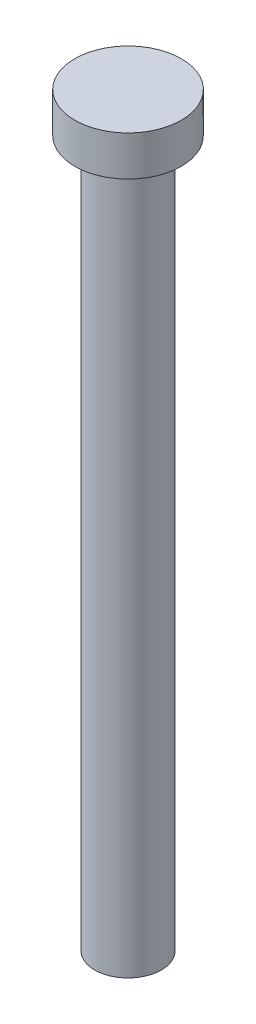
ISO-10303-21;
HEADER;
FILE_DESCRIPTION(('STEP AP214'),'2;1');
FILE_NAME('part.step','',(''),(''),'','','');
FILE_SCHEMA(('AUTOMOTIVE_DESIGN { 1 0 10303 214 1 1 1 1 }'));
ENDSEC;
DATA;
#1=APPLICATION_CONTEXT('core data for automotive mechanical design processes');
#2=APPLICATION_PROTOCOL_DEFINITION('international standard','automotive_design',2000,#1);
#3=PRODUCT_CONTEXT('',#1,'mechanical');
#4=PRODUCT('Part','Part','',(#3));
#5=PRODUCT_RELATED_PRODUCT_CATEGORY('part','',(#4));
#6=PRODUCT_DEFINITION_FORMATION('','',#4);
#7=PRODUCT_DEFINITION_CONTEXT('part definition',#1,'design');
#8=PRODUCT_DEFINITION('design','',#6,#7);
#9=PRODUCT_DEFINITION_SHAPE('','',#8);
#10=(LENGTH_UNIT() NAMED_UNIT(*) SI_UNIT(.MILLI.,.METRE.));
#11=(NAMED_UNIT(*) PLANE_ANGLE_UNIT() SI_UNIT($,.RADIAN.));
#12=(NAMED_UNIT(*) SI_UNIT($,.STERADIAN.) SOLID_ANGLE_UNIT());
#13=UNCERTAINTY_MEASURE_WITH_UNIT(LENGTH_MEASURE(1.E-05),#10,'distance_accuracy_value','');
#14=(GEOMETRIC_REPRESENTATION_CONTEXT(3) GLOBAL_UNCERTAINTY_ASSIGNED_CONTEXT((#13)) GLOBAL_UNIT_ASSIGNED_CONTEXT((#10,
#11,#12)) REPRESENTATION_CONTEXT('',''));
#15=CARTESIAN_POINT('',(0.,0.,0.));
#16=DIRECTION('',(0.,0.,1.));
#17=DIRECTION('',(1.,0.,0.));
#18=AXIS2_PLACEMENT_3D('',#15,#16,#17);
#19=CARTESIAN_POINT('',(0.,67.31,0.));
#20=DIRECTION('',(0.,-1.,0.));
#21=DIRECTION('',(0.,0.,-1.));
#22=AXIS2_PLACEMENT_3D('',#19,#20,#21);
#23=CYLINDRICAL_SURFACE('',#22,3.175);
#24=CARTESIAN_POINT('',(0.,67.31,0.));
#25=DIRECTION('',(0.,1.,0.));
#26=DIRECTION('',(0.,0.,1.));
#27=AXIS2_PLACEMENT_3D('',#24,#25,#26);
#28=CIRCLE('',#27,3.175);
#29=CARTESIAN_POINT('',(0.,67.31,3.175));
#30=VERTEX_POINT('',#29);
#31=EDGE_CURVE('E10',#30,#30,#28,.T.);
#32=ORIENTED_EDGE('',*,*,#31,.F.);
#33=EDGE_LOOP('',(#32));
#34=FACE_BOUND('',#33,.T.);
#35=CARTESIAN_POINT('',(0.,0.,0.));
#36=DIRECTION('',(0.,1.,0.));
#37=DIRECTION('',(0.,0.,1.));
#38=AXIS2_PLACEMENT_3D('',#35,#36,#37);
#39=CIRCLE('',#38,3.175);
#40=CARTESIAN_POINT('',(0.,0.,3.175));
#41=VERTEX_POINT('',#40);
#42=EDGE_CURVE('E33',#41,#41,#39,.T.);
#43=ORIENTED_EDGE('',*,*,#42,.T.);
#44=EDGE_LOOP('',(#43));
#45=FACE_BOUND('',#44,.T.);
#46=ADVANCED_FACE('F30',(#34,#45),#23,.T.);
#47=CARTESIAN_POINT('',(0.,0.,0.));
#48=DIRECTION('',(0.,1.,0.));
#49=DIRECTION('',(0.,0.,1.));
#50=AXIS2_PLACEMENT_3D('',#47,#48,#49);
#51=PLANE('',#50);
#52=ORIENTED_EDGE('',*,*,#42,.F.);
#53=EDGE_LOOP('',(#52));
#54=FACE_BOUND('',#53,.T.);
#55=ADVANCED_FACE('F53',(#54),#51,.F.);
#56=CARTESIAN_POINT('',(0.,71.12,0.));
#57=DIRECTION('',(0.,-1.,0.));
#58=DIRECTION('',(0.,0.,-1.));
#59=AXIS2_PLACEMENT_3D('',#56,#57,#58);
#60=CYLINDRICAL_SURFACE('',#59,5.08);
#61=CARTESIAN_POINT('',(0.,71.12,0.));
#62=DIRECTION('',(0.,1.,0.));
#63=DIRECTION('',(0.,0.,1.));
#64=AXIS2_PLACEMENT_3D('',#61,#62,#63);
#65=CIRCLE('',#64,5.08);
#66=CARTESIAN_POINT('',(0.,71.12,-5.08));
#67=VERTEX_POINT('',#66);
#68=EDGE_CURVE('E40',#67,#67,#65,.T.);
#69=CARTESIAN_POINT('',(0.,67.31,0.));
#70=DIRECTION('',(0.,1.,0.));
#71=DIRECTION('',(0.,0.,1.));
#72=AXIS2_PLACEMENT_3D('',#69,#70,#71);
#73=CIRCLE('',#72,5.08);
#74=CARTESIAN_POINT('',(0.,67.31,-5.08));
#75=VERTEX_POINT('',#74);
#76=EDGE_CURVE('E42',#75,#75,#73,.T.);
#77=CARTESIAN_POINT('',(0.,71.12,-5.08));
#78=CARTESIAN_POINT('',(0.,71.0803125,-5.08));
#79=CARTESIAN_POINT('',(0.,71.040625,-5.08));
#80=CARTESIAN_POINT('',(0.,70.96125,-5.08));
#81=CARTESIAN_POINT('',(0.,70.9215625,-5.08));
#82=CARTESIAN_POINT('',(0.,70.8421875,-5.08));
#83=CARTESIAN_POINT('',(0.,70.8025,-5.08));
#84=CARTESIAN_POINT('',(0.,70.723125,-5.08));
#85=CARTESIAN_POINT('',(0.,70.6834375,-5.08));
#86=CARTESIAN_POINT('',(0.,70.6040625,-5.08));
#87=CARTESIAN_POINT('',(0.,70.564375,-5.08));
#88=CARTESIAN_POINT('',(0.,70.485,-5.08));
#89=CARTESIAN_POINT('',(0.,70.4453125,-5.08));
#90=CARTESIAN_POINT('',(0.,70.3659375,-5.08));
#91=CARTESIAN_POINT('',(0.,70.32625,-5.08));
#92=CARTESIAN_POINT('',(0.,70.246875,-5.08));
#93=CARTESIAN_POINT('',(0.,70.2071875,-5.08));
#94=CARTESIAN_POINT('',(0.,70.1278125,-5.08));
#95=CARTESIAN_POINT('',(0.,70.088125,-5.08));
#96=CARTESIAN_POINT('',(0.,70.00875,-5.08));
#97=CARTESIAN_POINT('',(0.,69.9690625,-5.08));
#98=CARTESIAN_POINT('',(0.,69.8896875,-5.08));
#99=CARTESIAN_POINT('',(0.,69.85,-5.08));
#100=CARTESIAN_POINT('',(0.,69.770625,-5.08));
#101=CARTESIAN_POINT('',(0.,69.7309375,-5.08));
#102=CARTESIAN_POINT('',(0.,69.6515625,-5.08));
#103=CARTESIAN_POINT('',(0.,69.611875,-5.08));
#104=CARTESIAN_POINT('',(0.,69.5325,-5.08));
#105=CARTESIAN_POINT('',(0.,69.4928125,-5.08));
#106=CARTESIAN_POINT('',(0.,69.4134375,-5.08));
#107=CARTESIAN_POINT('',(0.,69.37375,-5.08));
#108=CARTESIAN_POINT('',(0.,69.294375,-5.08));
#109=CARTESIAN_POINT('',(0.,69.2546875,-5.08));
#110=CARTESIAN_POINT('',(0.,69.1753125,-5.08));
#111=CARTESIAN_POINT('',(0.,69.135625,-5.08));
#112=CARTESIAN_POINT('',(0.,69.05625,-5.08));
#113=CARTESIAN_POINT('',(0.,69.0165625,-5.08));
#114=CARTESIAN_POINT('',(0.,68.9371875,-5.08));
#115=CARTESIAN_POINT('',(0.,68.8975,-5.08));
#116=CARTESIAN_POINT('',(0.,68.818125,-5.08));
#117=CARTESIAN_POINT('',(0.,68.7784375,-5.08));
#118=CARTESIAN_POINT('',(0.,68.6990625,-5.08));
#119=CARTESIAN_POINT('',(0.,68.659375,-5.08));
#120=CARTESIAN_POINT('',(0.,68.58,-5.08));
#121=CARTESIAN_POINT('',(0.,68.5403125,-5.08));
#122=CARTESIAN_POINT('',(0.,68.4609375,-5.08));
#123=CARTESIAN_POINT('',(0.,68.42125,-5.08));
#124=CARTESIAN_POINT('',(0.,68.341875,-5.08));
#125=CARTESIAN_POINT('',(0.,68.3021875,-5.08));
#126=CARTESIAN_POINT('',(0.,68.2228125,-5.08));
#127=CARTESIAN_POINT('',(0.,68.183125,-5.08));
#128=CARTESIAN_POINT('',(0.,68.10375,-5.08));
#129=CARTESIAN_POINT('',(0.,68.0640625,-5.08));
#130=CARTESIAN_POINT('',(0.,67.9846875,-5.08));
#131=CARTESIAN_POINT('',(0.,67.945,-5.08));
#132=CARTESIAN_POINT('',(0.,67.865625,-5.08));
#133=CARTESIAN_POINT('',(0.,67.8259375,-5.08));
#134=CARTESIAN_POINT('',(0.,67.7465625,-5.08));
#135=CARTESIAN_POINT('',(0.,67.706875,-5.08));
#136=CARTESIAN_POINT('',(0.,67.6275,-5.08));
#137=CARTESIAN_POINT('',(0.,67.5878125,-5.08));
#138=CARTESIAN_POINT('',(0.,67.5084375,-5.08));
#139=CARTESIAN_POINT('',(0.,67.46875,-5.08));
#140=CARTESIAN_POINT('',(0.,67.389375,-5.08));
#141=CARTESIAN_POINT('',(0.,67.3496875,-5.08));
#142=CARTESIAN_POINT('',(0.,67.31,-5.08));
#143=B_SPLINE_CURVE_WITH_KNOTS('',3,(#77,#78,#79,#80,#81,#82,#83,#84,#85,#86,#87,#88,#89,#90,
#91,#92,#93,#94,#95,#96,#97,#98,#99,#100,#101,#102,#103,#104,#105,#106,#107,#108,#109,#110,#111,
#112,#113,#114,#115,#116,#117,#118,#119,#120,#121,#122,#123,#124,#125,#126,#127,#128,#129,#130,
#131,#132,#133,#134,#135,#136,#137,#138,#139,#140,#141,#142),.UNSPECIFIED.,.F.,.F.,(4,2,2,2,2,2,
2,2,2,2,2,2,2,2,2,2,2,2,2,2,2,2,2,2,2,2,2,2,2,2,2,2,4),(0.,0.119062499999989,0.238124999999992,
0.357187499999995,0.476249999999998,0.595312499999986,0.714374999999989,0.833437499999992,
0.952499999999995,1.0715625,1.19062499999999,1.30968749999999,1.42874999999999,1.5478125,
1.66687499999998,1.78593749999999,1.90499999999999,2.02406249999999,2.143125,2.26218749999998,
2.38124999999999,2.50031249999999,2.61937499999999,2.73843749999998,2.85749999999998,
2.97656249999999,3.09562499999999,3.21468749999999,3.33374999999998,3.45281249999999,
3.57187499999999,3.69093749999999,3.80999999999998),.UNSPECIFIED.);
#144=EDGE_CURVE('BSEAM50',#67,#75,#143,.T.);
#145=ORIENTED_EDGE('',*,*,#68,.F.);
#146=ORIENTED_EDGE('',*,*,#76,.T.);
#147=ORIENTED_EDGE('',*,*,#144,.T.);
#148=ORIENTED_EDGE('',*,*,#144,.F.);
#149=EDGE_LOOP('',(#145,#147,#146,#148));
#150=FACE_BOUND('',#149,.T.);
#151=ADVANCED_FACE('F50',(#150),#60,.T.);
#152=CARTESIAN_POINT('',(0.,71.12,0.));
#153=DIRECTION('',(0.,1.,0.));
#154=DIRECTION('',(0.,0.,1.));
#155=AXIS2_PLACEMENT_3D('',#152,#153,#154);
#156=PLANE('',#155);
#157=ORIENTED_EDGE('',*,*,#68,.T.);
#158=EDGE_LOOP('',(#157));
#159=FACE_BOUND('',#158,.T.);
#160=ADVANCED_FACE('F48',(#159),#156,.T.);
#161=CARTESIAN_POINT('',(0.,67.31,0.));
#162=DIRECTION('',(0.,1.,0.));
#163=DIRECTION('',(0.,0.,1.));
#164=AXIS2_PLACEMENT_3D('',#161,#162,#163);
#165=PLANE('',#164);
#166=ORIENTED_EDGE('',*,*,#31,.T.);
#167=EDGE_LOOP('',(#166));
#168=FACE_BOUND('',#167,.T.);
#169=ORIENTED_EDGE('',*,*,#76,.F.);
#170=EDGE_LOOP('',(#169));
#171=FACE_BOUND('',#170,.T.);
#172=ADVANCED_FACE('F57',(#168,#171),#165,.F.);
#173=CLOSED_SHELL('',(#46,#55,#151,#160,#172));
#174=MANIFOLD_SOLID_BREP('B2',#173);
#175=ADVANCED_BREP_SHAPE_REPRESENTATION('',(#18,#174),#14);
#176=SHAPE_DEFINITION_REPRESENTATION(#9,#175);
ENDSEC;
END-ISO-10303-21;
